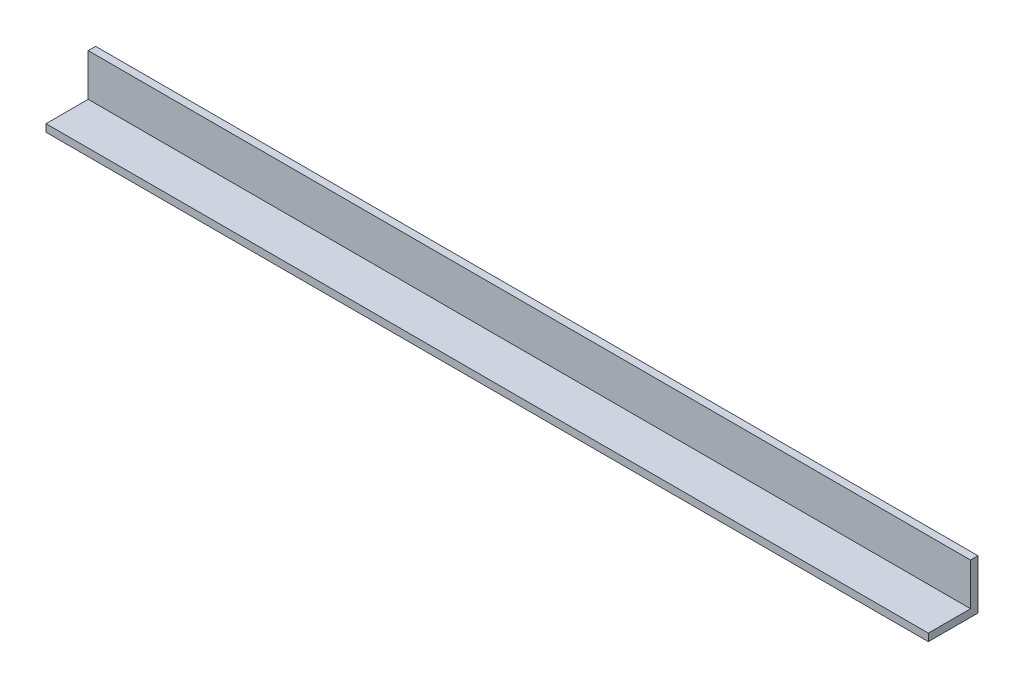
ISO-10303-21;
HEADER;
FILE_DESCRIPTION(('STEP AP214'),'2;1');
FILE_NAME('part.step','',(''),(''),'','','');
FILE_SCHEMA(('AUTOMOTIVE_DESIGN { 1 0 10303 214 1 1 1 1 }'));
ENDSEC;
DATA;
#1=APPLICATION_CONTEXT('core data for automotive mechanical design processes');
#2=APPLICATION_PROTOCOL_DEFINITION('international standard','automotive_design',2000,#1);
#3=PRODUCT_CONTEXT('',#1,'mechanical');
#4=PRODUCT('Part','Part','',(#3));
#5=PRODUCT_RELATED_PRODUCT_CATEGORY('part','',(#4));
#6=PRODUCT_DEFINITION_FORMATION('','',#4);
#7=PRODUCT_DEFINITION_CONTEXT('part definition',#1,'design');
#8=PRODUCT_DEFINITION('design','',#6,#7);
#9=PRODUCT_DEFINITION_SHAPE('','',#8);
#10=(LENGTH_UNIT() NAMED_UNIT(*) SI_UNIT(.MILLI.,.METRE.));
#11=(NAMED_UNIT(*) PLANE_ANGLE_UNIT() SI_UNIT($,.RADIAN.));
#12=(NAMED_UNIT(*) SI_UNIT($,.STERADIAN.) SOLID_ANGLE_UNIT());
#13=UNCERTAINTY_MEASURE_WITH_UNIT(LENGTH_MEASURE(1.E-05),#10,'distance_accuracy_value','');
#14=(GEOMETRIC_REPRESENTATION_CONTEXT(3) GLOBAL_UNCERTAINTY_ASSIGNED_CONTEXT((#13)) GLOBAL_UNIT_ASSIGNED_CONTEXT((#10,
#11,#12)) REPRESENTATION_CONTEXT('',''));
#15=CARTESIAN_POINT('',(0.,0.,0.));
#16=DIRECTION('',(0.,0.,1.));
#17=DIRECTION('',(1.,0.,0.));
#18=AXIS2_PLACEMENT_3D('',#15,#16,#17);
#19=CARTESIAN_POINT('',(0.,0.,80.));
#20=DIRECTION('',(1.,0.,0.));
#21=DIRECTION('',(0.,0.,-1.));
#22=AXIS2_PLACEMENT_3D('',#19,#20,#21);
#23=PLANE('',#22);
#24=DIRECTION('',(0.,0.,1.));
#25=VECTOR('',#24,1.);
#26=CARTESIAN_POINT('',(0.,12.,12.));
#27=LINE('',#26,#25);
#28=CARTESIAN_POINT('',(0.,12.,12.));
#29=VERTEX_POINT('',#28);
#30=CARTESIAN_POINT('',(0.,12.,80.));
#31=VERTEX_POINT('',#30);
#32=EDGE_CURVE('E46',#29,#31,#27,.T.);
#33=ORIENTED_EDGE('',*,*,#32,.F.);
#34=DIRECTION('',(0.,-1.,0.));
#35=VECTOR('',#34,1.);
#36=CARTESIAN_POINT('',(0.,80.,12.));
#37=LINE('',#36,#35);
#38=CARTESIAN_POINT('',(0.,80.,12.));
#39=VERTEX_POINT('',#38);
#40=EDGE_CURVE('E82',#39,#29,#37,.T.);
#41=ORIENTED_EDGE('',*,*,#40,.F.);
#42=DIRECTION('',(0.,0.,-1.));
#43=VECTOR('',#42,1.);
#44=CARTESIAN_POINT('',(0.,80.,80.));
#45=LINE('',#44,#43);
#46=CARTESIAN_POINT('',(0.,80.,0.));
#47=VERTEX_POINT('',#46);
#48=EDGE_CURVE('E75',#39,#47,#45,.T.);
#49=ORIENTED_EDGE('',*,*,#48,.T.);
#50=DIRECTION('',(0.,-1.,0.));
#51=VECTOR('',#50,1.);
#52=CARTESIAN_POINT('',(0.,0.,0.));
#53=LINE('',#52,#51);
#54=CARTESIAN_POINT('',(0.,0.,0.));
#55=VERTEX_POINT('',#54);
#56=EDGE_CURVE('E79',#47,#55,#53,.T.);
#57=ORIENTED_EDGE('',*,*,#56,.T.);
#58=DIRECTION('',(0.,0.,-1.));
#59=VECTOR('',#58,1.);
#60=CARTESIAN_POINT('',(0.,0.,80.));
#61=LINE('',#60,#59);
#62=CARTESIAN_POINT('',(0.,0.,80.));
#63=VERTEX_POINT('',#62);
#64=EDGE_CURVE('E11',#63,#55,#61,.T.);
#65=ORIENTED_EDGE('',*,*,#64,.F.);
#66=DIRECTION('',(0.,-1.,0.));
#67=VECTOR('',#66,1.);
#68=CARTESIAN_POINT('',(0.,0.,80.));
#69=LINE('',#68,#67);
#70=EDGE_CURVE('E95',#31,#63,#69,.T.);
#71=ORIENTED_EDGE('',*,*,#70,.F.);
#72=EDGE_LOOP('',(#33,#41,#49,#57,#65,#71));
#73=FACE_BOUND('',#72,.T.);
#74=ADVANCED_FACE('F32',(#73),#23,.F.);
#75=CARTESIAN_POINT('',(0.,0.,80.));
#76=DIRECTION('',(0.,1.,0.));
#77=DIRECTION('',(0.,0.,1.));
#78=AXIS2_PLACEMENT_3D('',#75,#76,#77);
#79=PLANE('',#78);
#80=DIRECTION('',(1.,0.,0.));
#81=VECTOR('',#80,1.);
#82=CARTESIAN_POINT('',(0.,0.,0.));
#83=LINE('',#82,#81);
#84=CARTESIAN_POINT('',(1422.,0.,0.));
#85=VERTEX_POINT('',#84);
#86=EDGE_CURVE('E99',#55,#85,#83,.T.);
#87=ORIENTED_EDGE('',*,*,#86,.T.);
#88=DIRECTION('',(0.,0.,-1.));
#89=VECTOR('',#88,1.);
#90=CARTESIAN_POINT('',(1422.,0.,80.));
#91=LINE('',#90,#89);
#92=CARTESIAN_POINT('',(1422.,0.,80.));
#93=VERTEX_POINT('',#92);
#94=EDGE_CURVE('E39',#93,#85,#91,.T.);
#95=ORIENTED_EDGE('',*,*,#94,.F.);
#96=DIRECTION('',(1.,0.,0.));
#97=VECTOR('',#96,1.);
#98=CARTESIAN_POINT('',(0.,0.,80.));
#99=LINE('',#98,#97);
#100=EDGE_CURVE('E55',#63,#93,#99,.T.);
#101=ORIENTED_EDGE('',*,*,#100,.F.);
#102=ORIENTED_EDGE('',*,*,#64,.T.);
#103=EDGE_LOOP('',(#87,#95,#101,#102));
#104=FACE_BOUND('',#103,.T.);
#105=ADVANCED_FACE('F116',(#104),#79,.F.);
#106=CARTESIAN_POINT('',(1422.,0.,80.));
#107=DIRECTION('',(-1.,0.,0.));
#108=DIRECTION('',(0.,0.,1.));
#109=AXIS2_PLACEMENT_3D('',#106,#107,#108);
#110=PLANE('',#109);
#111=DIRECTION('',(0.,0.,-1.));
#112=VECTOR('',#111,1.);
#113=CARTESIAN_POINT('',(1422.,80.,80.));
#114=LINE('',#113,#112);
#115=CARTESIAN_POINT('',(1422.,80.,12.));
#116=VERTEX_POINT('',#115);
#117=CARTESIAN_POINT('',(1422.,80.,0.));
#118=VERTEX_POINT('',#117);
#119=EDGE_CURVE('E85',#116,#118,#114,.T.);
#120=ORIENTED_EDGE('',*,*,#119,.F.);
#121=DIRECTION('',(0.,-1.,0.));
#122=VECTOR('',#121,1.);
#123=CARTESIAN_POINT('',(1422.,80.,12.));
#124=LINE('',#123,#122);
#125=CARTESIAN_POINT('',(1422.,12.,12.));
#126=VERTEX_POINT('',#125);
#127=EDGE_CURVE('E126',#116,#126,#124,.T.);
#128=ORIENTED_EDGE('',*,*,#127,.T.);
#129=DIRECTION('',(0.,0.,1.));
#130=VECTOR('',#129,1.);
#131=CARTESIAN_POINT('',(1422.,12.,12.));
#132=LINE('',#131,#130);
#133=CARTESIAN_POINT('',(1422.,12.,80.));
#134=VERTEX_POINT('',#133);
#135=EDGE_CURVE('E123',#126,#134,#132,.T.);
#136=ORIENTED_EDGE('',*,*,#135,.T.);
#137=DIRECTION('',(0.,1.,0.));
#138=VECTOR('',#137,1.);
#139=CARTESIAN_POINT('',(1422.,0.,80.));
#140=LINE('',#139,#138);
#141=EDGE_CURVE('E86',#93,#134,#140,.T.);
#142=ORIENTED_EDGE('',*,*,#141,.F.);
#143=ORIENTED_EDGE('',*,*,#94,.T.);
#144=DIRECTION('',(0.,1.,0.));
#145=VECTOR('',#144,1.);
#146=CARTESIAN_POINT('',(1422.,0.,0.));
#147=LINE('',#146,#145);
#148=EDGE_CURVE('E96',#85,#118,#147,.T.);
#149=ORIENTED_EDGE('',*,*,#148,.T.);
#150=EDGE_LOOP('',(#120,#128,#136,#142,#143,#149));
#151=FACE_BOUND('',#150,.T.);
#152=ADVANCED_FACE('F113',(#151),#110,.F.);
#153=CARTESIAN_POINT('',(0.,80.,80.));
#154=DIRECTION('',(0.,-1.,0.));
#155=DIRECTION('',(0.,0.,-1.));
#156=AXIS2_PLACEMENT_3D('',#153,#154,#155);
#157=PLANE('',#156);
#158=ORIENTED_EDGE('',*,*,#48,.F.);
#159=DIRECTION('',(-1.,0.,0.));
#160=VECTOR('',#159,1.);
#161=CARTESIAN_POINT('',(1422.,80.,12.));
#162=LINE('',#161,#160);
#163=EDGE_CURVE('E100',#116,#39,#162,.T.);
#164=ORIENTED_EDGE('',*,*,#163,.F.);
#165=ORIENTED_EDGE('',*,*,#119,.T.);
#166=DIRECTION('',(-1.,0.,0.));
#167=VECTOR('',#166,1.);
#168=CARTESIAN_POINT('',(0.,80.,0.));
#169=LINE('',#168,#167);
#170=EDGE_CURVE('E89',#118,#47,#169,.T.);
#171=ORIENTED_EDGE('',*,*,#170,.T.);
#172=EDGE_LOOP('',(#158,#164,#165,#171));
#173=FACE_BOUND('',#172,.T.);
#174=ADVANCED_FACE('F90',(#173),#157,.F.);
#175=CARTESIAN_POINT('',(0.,80.,80.));
#176=DIRECTION('',(0.,0.,-1.));
#177=DIRECTION('',(-1.,0.,0.));
#178=AXIS2_PLACEMENT_3D('',#175,#176,#177);
#179=PLANE('',#178);
#180=ORIENTED_EDGE('',*,*,#141,.T.);
#181=DIRECTION('',(-1.,0.,0.));
#182=VECTOR('',#181,1.);
#183=CARTESIAN_POINT('',(1422.,12.,80.));
#184=LINE('',#183,#182);
#185=EDGE_CURVE('E104',#134,#31,#184,.T.);
#186=ORIENTED_EDGE('',*,*,#185,.T.);
#187=ORIENTED_EDGE('',*,*,#70,.T.);
#188=ORIENTED_EDGE('',*,*,#100,.T.);
#189=EDGE_LOOP('',(#180,#186,#187,#188));
#190=FACE_BOUND('',#189,.T.);
#191=ADVANCED_FACE('F142',(#190),#179,.F.);
#192=CARTESIAN_POINT('',(0.,80.,0.));
#193=DIRECTION('',(0.,0.,-1.));
#194=DIRECTION('',(-1.,0.,0.));
#195=AXIS2_PLACEMENT_3D('',#192,#193,#194);
#196=PLANE('',#195);
#197=ORIENTED_EDGE('',*,*,#56,.F.);
#198=ORIENTED_EDGE('',*,*,#170,.F.);
#199=ORIENTED_EDGE('',*,*,#148,.F.);
#200=ORIENTED_EDGE('',*,*,#86,.F.);
#201=EDGE_LOOP('',(#197,#198,#199,#200));
#202=FACE_BOUND('',#201,.T.);
#203=ADVANCED_FACE('F98',(#202),#196,.T.);
#204=CARTESIAN_POINT('',(1422.,80.,12.));
#205=DIRECTION('',(0.,0.,-1.));
#206=DIRECTION('',(0.,1.,0.));
#207=AXIS2_PLACEMENT_3D('',#204,#205,#206);
#208=PLANE('',#207);
#209=ORIENTED_EDGE('',*,*,#40,.T.);
#210=DIRECTION('',(-1.,0.,0.));
#211=VECTOR('',#210,1.);
#212=CARTESIAN_POINT('',(1422.,12.,12.));
#213=LINE('',#212,#211);
#214=EDGE_CURVE('E121',#126,#29,#213,.T.);
#215=ORIENTED_EDGE('',*,*,#214,.F.);
#216=ORIENTED_EDGE('',*,*,#127,.F.);
#217=ORIENTED_EDGE('',*,*,#163,.T.);
#218=EDGE_LOOP('',(#209,#215,#216,#217));
#219=FACE_BOUND('',#218,.T.);
#220=ADVANCED_FACE('F137',(#219),#208,.F.);
#221=CARTESIAN_POINT('',(1422.,12.,12.));
#222=DIRECTION('',(0.,-1.,0.));
#223=DIRECTION('',(0.,0.,-1.));
#224=AXIS2_PLACEMENT_3D('',#221,#222,#223);
#225=PLANE('',#224);
#226=ORIENTED_EDGE('',*,*,#32,.T.);
#227=ORIENTED_EDGE('',*,*,#185,.F.);
#228=ORIENTED_EDGE('',*,*,#135,.F.);
#229=ORIENTED_EDGE('',*,*,#214,.T.);
#230=EDGE_LOOP('',(#226,#227,#228,#229));
#231=FACE_BOUND('',#230,.T.);
#232=ADVANCED_FACE('F141',(#231),#225,.F.);
#233=CLOSED_SHELL('',(#74,#105,#152,#174,#191,#203,#220,#232));
#234=MANIFOLD_SOLID_BREP('B2',#233);
#235=ADVANCED_BREP_SHAPE_REPRESENTATION('',(#18,#234),#14);
#236=SHAPE_DEFINITION_REPRESENTATION(#9,#235);
ENDSEC;
END-ISO-10303-21;
